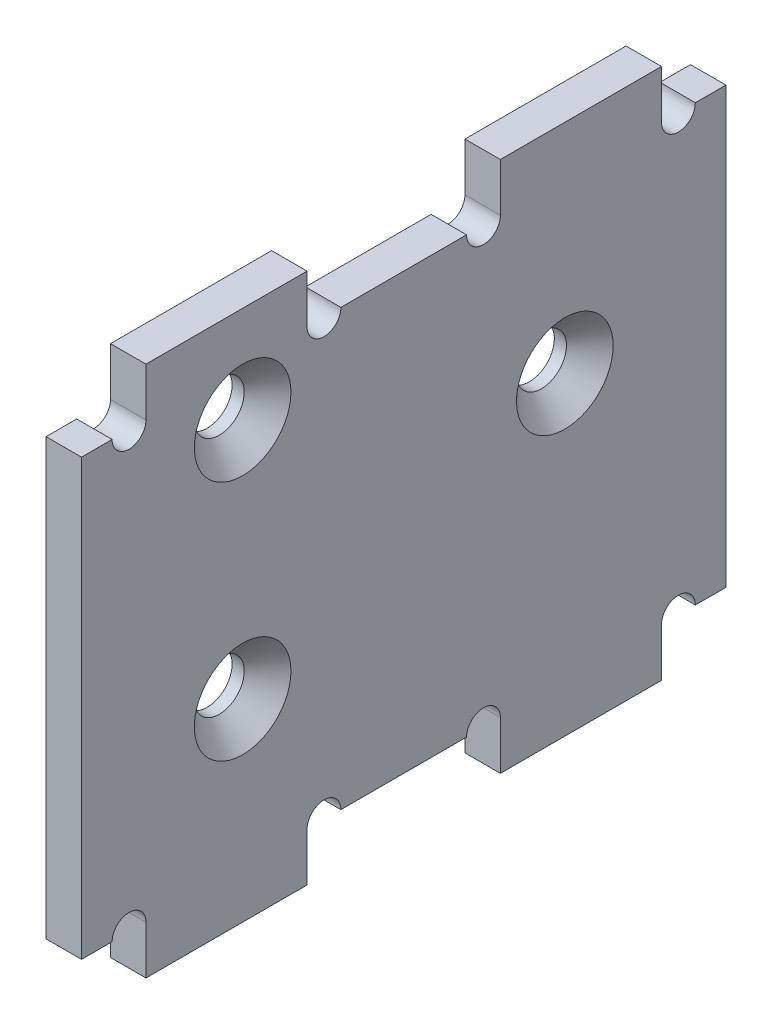
ISO-10303-21;
HEADER;
FILE_DESCRIPTION(('STEP AP214'),'2;1');
FILE_NAME('part.step','',(''),(''),'','','');
FILE_SCHEMA(('AUTOMOTIVE_DESIGN { 1 0 10303 214 1 1 1 1 }'));
ENDSEC;
DATA;
#1=APPLICATION_CONTEXT('core data for automotive mechanical design processes');
#2=APPLICATION_PROTOCOL_DEFINITION('international standard','automotive_design',2000,#1);
#3=PRODUCT_CONTEXT('',#1,'mechanical');
#4=PRODUCT('Part','Part','',(#3));
#5=PRODUCT_RELATED_PRODUCT_CATEGORY('part','',(#4));
#6=PRODUCT_DEFINITION_FORMATION('','',#4);
#7=PRODUCT_DEFINITION_CONTEXT('part definition',#1,'design');
#8=PRODUCT_DEFINITION('design','',#6,#7);
#9=PRODUCT_DEFINITION_SHAPE('','',#8);
#10=(LENGTH_UNIT() NAMED_UNIT(*) SI_UNIT(.MILLI.,.METRE.));
#11=(NAMED_UNIT(*) PLANE_ANGLE_UNIT() SI_UNIT($,.RADIAN.));
#12=(NAMED_UNIT(*) SI_UNIT($,.STERADIAN.) SOLID_ANGLE_UNIT());
#13=UNCERTAINTY_MEASURE_WITH_UNIT(LENGTH_MEASURE(1.E-05),#10,'distance_accuracy_value','');
#14=(GEOMETRIC_REPRESENTATION_CONTEXT(3) GLOBAL_UNCERTAINTY_ASSIGNED_CONTEXT((#13)) GLOBAL_UNIT_ASSIGNED_CONTEXT((#10,
#11,#12)) REPRESENTATION_CONTEXT('',''));
#15=CARTESIAN_POINT('',(0.,0.,0.));
#16=DIRECTION('',(0.,0.,1.));
#17=DIRECTION('',(1.,0.,0.));
#18=AXIS2_PLACEMENT_3D('',#15,#16,#17);
#19=CARTESIAN_POINT('',(2.2,10.5,9.99999999999999));
#20=DIRECTION('',(-1.,0.,0.));
#21=DIRECTION('',(0.,0.,1.));
#22=AXIS2_PLACEMENT_3D('',#19,#20,#21);
#23=CYLINDRICAL_SURFACE('',#22,1.55);
#24=CARTESIAN_POINT('',(0.,10.5,9.99999999999999));
#25=DIRECTION('',(1.,0.,0.));
#26=DIRECTION('',(0.,0.,-1.));
#27=AXIS2_PLACEMENT_3D('',#24,#25,#26);
#28=CIRCLE('',#27,1.55);
#29=CARTESIAN_POINT('',(0.,10.5,8.44999999999999));
#30=VERTEX_POINT('',#29);
#31=EDGE_CURVE('E272',#30,#30,#28,.T.);
#32=ORIENTED_EDGE('',*,*,#31,.F.);
#33=EDGE_LOOP('',(#32));
#34=FACE_BOUND('',#33,.T.);
#35=CARTESIAN_POINT('',(0.750000000000001,10.5,9.99999999999999));
#36=DIRECTION('',(1.,0.,0.));
#37=DIRECTION('',(0.,0.,-1.));
#38=AXIS2_PLACEMENT_3D('',#35,#36,#37);
#39=CIRCLE('',#38,1.55);
#40=CARTESIAN_POINT('',(0.750000000000001,10.5,8.44999999999999));
#41=VERTEX_POINT('',#40);
#42=EDGE_CURVE('E426',#41,#41,#39,.T.);
#43=ORIENTED_EDGE('',*,*,#42,.T.);
#44=EDGE_LOOP('',(#43));
#45=FACE_BOUND('',#44,.T.);
#46=ADVANCED_FACE('F39',(#34,#45),#23,.F.);
#47=CARTESIAN_POINT('',(2.2,-13.5,0.));
#48=DIRECTION('',(0.,-1.,0.));
#49=DIRECTION('',(0.,0.,-1.));
#50=AXIS2_PLACEMENT_3D('',#47,#48,#49);
#51=PLANE('',#50);
#52=DIRECTION('',(0.,0.,1.));
#53=VECTOR('',#52,1.);
#54=CARTESIAN_POINT('',(0.,-13.5,0.));
#55=LINE('',#54,#53);
#56=CARTESIAN_POINT('',(0.,-13.5,18.1));
#57=VERTEX_POINT('',#56);
#58=CARTESIAN_POINT('',(0.,-13.5,20.));
#59=VERTEX_POINT('',#58);
#60=EDGE_CURVE('E256',#57,#59,#55,.T.);
#61=ORIENTED_EDGE('',*,*,#60,.F.);
#62=DIRECTION('',(-1.,0.,0.));
#63=VECTOR('',#62,1.);
#64=CARTESIAN_POINT('',(2.2,-13.5,18.1));
#65=LINE('',#64,#63);
#66=CARTESIAN_POINT('',(2.2,-13.5,18.1));
#67=VERTEX_POINT('',#66);
#68=EDGE_CURVE('E12',#67,#57,#65,.T.);
#69=ORIENTED_EDGE('',*,*,#68,.F.);
#70=DIRECTION('',(0.,0.,1.));
#71=VECTOR('',#70,1.);
#72=CARTESIAN_POINT('',(2.2,-13.5,0.));
#73=LINE('',#72,#71);
#74=CARTESIAN_POINT('',(2.2,-13.5,20.));
#75=VERTEX_POINT('',#74);
#76=EDGE_CURVE('E444',#67,#75,#73,.T.);
#77=ORIENTED_EDGE('',*,*,#76,.T.);
#78=DIRECTION('',(-1.,0.,0.));
#79=VECTOR('',#78,1.);
#80=CARTESIAN_POINT('',(2.2,-13.5,20.));
#81=LINE('',#80,#79);
#82=EDGE_CURVE('E56',#75,#59,#81,.T.);
#83=ORIENTED_EDGE('',*,*,#82,.T.);
#84=EDGE_LOOP('',(#61,#69,#77,#83));
#85=FACE_BOUND('',#84,.T.);
#86=ADVANCED_FACE('F41',(#85),#51,.T.);
#87=CARTESIAN_POINT('',(2.2,-13.5,17.05));
#88=DIRECTION('',(-1.,0.,0.));
#89=DIRECTION('',(0.,0.,1.));
#90=AXIS2_PLACEMENT_3D('',#87,#88,#89);
#91=CYLINDRICAL_SURFACE('',#90,1.05);
#92=CARTESIAN_POINT('',(0.,-13.5,17.05));
#93=DIRECTION('',(1.,0.,0.));
#94=DIRECTION('',(0.,0.,-1.));
#95=AXIS2_PLACEMENT_3D('',#92,#93,#94);
#96=CIRCLE('',#95,1.05);
#97=CARTESIAN_POINT('',(0.,-13.5,16.));
#98=VERTEX_POINT('',#97);
#99=EDGE_CURVE('E259',#57,#98,#96,.F.);
#100=ORIENTED_EDGE('',*,*,#99,.T.);
#101=DIRECTION('',(-1.,0.,0.));
#102=VECTOR('',#101,1.);
#103=CARTESIAN_POINT('',(2.2,-13.5,16.));
#104=LINE('',#103,#102);
#105=CARTESIAN_POINT('',(2.2,-13.5,16.));
#106=VERTEX_POINT('',#105);
#107=EDGE_CURVE('E48',#106,#98,#104,.T.);
#108=ORIENTED_EDGE('',*,*,#107,.F.);
#109=CARTESIAN_POINT('',(2.2,-13.5,17.05));
#110=DIRECTION('',(1.,0.,0.));
#111=DIRECTION('',(0.,0.,-1.));
#112=AXIS2_PLACEMENT_3D('',#109,#110,#111);
#113=CIRCLE('',#112,1.05);
#114=EDGE_CURVE('E446',#67,#106,#113,.F.);
#115=ORIENTED_EDGE('',*,*,#114,.F.);
#116=ORIENTED_EDGE('',*,*,#68,.T.);
#117=EDGE_LOOP('',(#100,#108,#115,#116));
#118=FACE_BOUND('',#117,.T.);
#119=ADVANCED_FACE('F401',(#118),#91,.F.);
#120=CARTESIAN_POINT('',(2.2,0.,16.));
#121=DIRECTION('',(0.,0.,-1.));
#122=DIRECTION('',(0.,1.,0.));
#123=AXIS2_PLACEMENT_3D('',#120,#121,#122);
#124=PLANE('',#123);
#125=DIRECTION('',(0.,-1.,0.));
#126=VECTOR('',#125,1.);
#127=CARTESIAN_POINT('',(0.,0.,16.));
#128=LINE('',#127,#126);
#129=CARTESIAN_POINT('',(0.,-16.5,16.));
#130=VERTEX_POINT('',#129);
#131=EDGE_CURVE('E285',#98,#130,#128,.T.);
#132=ORIENTED_EDGE('',*,*,#131,.T.);
#133=DIRECTION('',(-1.,0.,0.));
#134=VECTOR('',#133,1.);
#135=CARTESIAN_POINT('',(2.2,-16.5,16.));
#136=LINE('',#135,#134);
#137=CARTESIAN_POINT('',(2.2,-16.5,16.));
#138=VERTEX_POINT('',#137);
#139=EDGE_CURVE('E563',#138,#130,#136,.T.);
#140=ORIENTED_EDGE('',*,*,#139,.F.);
#141=DIRECTION('',(0.,-1.,0.));
#142=VECTOR('',#141,1.);
#143=CARTESIAN_POINT('',(2.2,0.,16.));
#144=LINE('',#143,#142);
#145=EDGE_CURVE('E449',#106,#138,#144,.T.);
#146=ORIENTED_EDGE('',*,*,#145,.F.);
#147=ORIENTED_EDGE('',*,*,#107,.T.);
#148=EDGE_LOOP('',(#132,#140,#146,#147));
#149=FACE_BOUND('',#148,.T.);
#150=ADVANCED_FACE('F570',(#149),#124,.F.);
#151=CARTESIAN_POINT('',(2.2,-16.5,0.));
#152=DIRECTION('',(0.,1.,0.));
#153=DIRECTION('',(0.,0.,1.));
#154=AXIS2_PLACEMENT_3D('',#151,#152,#153);
#155=PLANE('',#154);
#156=DIRECTION('',(0.,0.,-1.));
#157=VECTOR('',#156,1.);
#158=CARTESIAN_POINT('',(0.,-16.5,0.));
#159=LINE('',#158,#157);
#160=CARTESIAN_POINT('',(0.,-16.5,5.99999999999999));
#161=VERTEX_POINT('',#160);
#162=EDGE_CURVE('E287',#130,#161,#159,.T.);
#163=ORIENTED_EDGE('',*,*,#162,.T.);
#164=DIRECTION('',(-1.,0.,0.));
#165=VECTOR('',#164,1.);
#166=CARTESIAN_POINT('',(2.2,-16.5,5.99999999999999));
#167=LINE('',#166,#165);
#168=CARTESIAN_POINT('',(2.2,-16.5,5.99999999999999));
#169=VERTEX_POINT('',#168);
#170=EDGE_CURVE('E560',#169,#161,#167,.T.);
#171=ORIENTED_EDGE('',*,*,#170,.F.);
#172=DIRECTION('',(0.,0.,-1.));
#173=VECTOR('',#172,1.);
#174=CARTESIAN_POINT('',(2.2,-16.5,0.));
#175=LINE('',#174,#173);
#176=EDGE_CURVE('E451',#138,#169,#175,.T.);
#177=ORIENTED_EDGE('',*,*,#176,.F.);
#178=ORIENTED_EDGE('',*,*,#139,.T.);
#179=EDGE_LOOP('',(#163,#171,#177,#178));
#180=FACE_BOUND('',#179,.T.);
#181=ADVANCED_FACE('F578',(#180),#155,.F.);
#182=CARTESIAN_POINT('',(2.2,0.,6.));
#183=DIRECTION('',(0.,0.,1.));
#184=DIRECTION('',(0.,-1.,0.));
#185=AXIS2_PLACEMENT_3D('',#182,#183,#184);
#186=PLANE('',#185);
#187=DIRECTION('',(0.,1.,0.));
#188=VECTOR('',#187,1.);
#189=CARTESIAN_POINT('',(0.,0.,6.));
#190=LINE('',#189,#188);
#191=CARTESIAN_POINT('',(0.,-13.5,6.));
#192=VERTEX_POINT('',#191);
#193=EDGE_CURVE('E290',#161,#192,#190,.T.);
#194=ORIENTED_EDGE('',*,*,#193,.T.);
#195=DIRECTION('',(-1.,0.,0.));
#196=VECTOR('',#195,1.);
#197=CARTESIAN_POINT('',(2.2,-13.5,6.));
#198=LINE('',#197,#196);
#199=CARTESIAN_POINT('',(2.2,-13.5,6.));
#200=VERTEX_POINT('',#199);
#201=EDGE_CURVE('E557',#200,#192,#198,.T.);
#202=ORIENTED_EDGE('',*,*,#201,.F.);
#203=DIRECTION('',(0.,1.,0.));
#204=VECTOR('',#203,1.);
#205=CARTESIAN_POINT('',(2.2,0.,6.));
#206=LINE('',#205,#204);
#207=EDGE_CURVE('E453',#169,#200,#206,.T.);
#208=ORIENTED_EDGE('',*,*,#207,.F.);
#209=ORIENTED_EDGE('',*,*,#170,.T.);
#210=EDGE_LOOP('',(#194,#202,#208,#209));
#211=FACE_BOUND('',#210,.T.);
#212=ADVANCED_FACE('F582',(#211),#186,.F.);
#213=CARTESIAN_POINT('',(2.2,-13.5,4.94999999999999));
#214=DIRECTION('',(-1.,0.,0.));
#215=DIRECTION('',(0.,0.,1.));
#216=AXIS2_PLACEMENT_3D('',#213,#214,#215);
#217=CYLINDRICAL_SURFACE('',#216,1.05);
#218=CARTESIAN_POINT('',(0.,-13.5,4.94999999999999));
#219=DIRECTION('',(1.,0.,0.));
#220=DIRECTION('',(0.,0.,-1.));
#221=AXIS2_PLACEMENT_3D('',#218,#219,#220);
#222=CIRCLE('',#221,1.05);
#223=CARTESIAN_POINT('',(0.,-13.5,3.89999999999999));
#224=VERTEX_POINT('',#223);
#225=EDGE_CURVE('E293',#192,#224,#222,.F.);
#226=ORIENTED_EDGE('',*,*,#225,.T.);
#227=DIRECTION('',(-1.,0.,0.));
#228=VECTOR('',#227,1.);
#229=CARTESIAN_POINT('',(2.2,-13.5,3.89999999999999));
#230=LINE('',#229,#228);
#231=CARTESIAN_POINT('',(2.2,-13.5,3.89999999999999));
#232=VERTEX_POINT('',#231);
#233=EDGE_CURVE('E555',#232,#224,#230,.T.);
#234=ORIENTED_EDGE('',*,*,#233,.F.);
#235=CARTESIAN_POINT('',(2.2,-13.5,4.94999999999999));
#236=DIRECTION('',(1.,0.,0.));
#237=DIRECTION('',(0.,0.,-1.));
#238=AXIS2_PLACEMENT_3D('',#235,#236,#237);
#239=CIRCLE('',#238,1.05);
#240=EDGE_CURVE('E455',#200,#232,#239,.F.);
#241=ORIENTED_EDGE('',*,*,#240,.F.);
#242=ORIENTED_EDGE('',*,*,#201,.T.);
#243=EDGE_LOOP('',(#226,#234,#241,#242));
#244=FACE_BOUND('',#243,.T.);
#245=ADVANCED_FACE('F597',(#244),#217,.F.);
#246=CARTESIAN_POINT('',(2.2,-13.5,0.));
#247=DIRECTION('',(0.,-1.,0.));
#248=DIRECTION('',(0.,0.,-1.));
#249=AXIS2_PLACEMENT_3D('',#246,#247,#248);
#250=PLANE('',#249);
#251=DIRECTION('',(0.,0.,1.));
#252=VECTOR('',#251,1.);
#253=CARTESIAN_POINT('',(0.,-13.5,0.));
#254=LINE('',#253,#252);
#255=CARTESIAN_POINT('',(0.,-13.5,-3.90000000000002));
#256=VERTEX_POINT('',#255);
#257=EDGE_CURVE('E299',#256,#224,#254,.T.);
#258=ORIENTED_EDGE('',*,*,#257,.F.);
#259=DIRECTION('',(-1.,0.,0.));
#260=VECTOR('',#259,1.);
#261=CARTESIAN_POINT('',(2.2,-13.5,-3.90000000000002));
#262=LINE('',#261,#260);
#263=CARTESIAN_POINT('',(2.2,-13.5,-3.90000000000002));
#264=VERTEX_POINT('',#263);
#265=EDGE_CURVE('E553',#264,#256,#262,.T.);
#266=ORIENTED_EDGE('',*,*,#265,.F.);
#267=DIRECTION('',(0.,0.,1.));
#268=VECTOR('',#267,1.);
#269=CARTESIAN_POINT('',(2.2,-13.5,0.));
#270=LINE('',#269,#268);
#271=EDGE_CURVE('E457',#264,#232,#270,.T.);
#272=ORIENTED_EDGE('',*,*,#271,.T.);
#273=ORIENTED_EDGE('',*,*,#233,.T.);
#274=EDGE_LOOP('',(#258,#266,#272,#273));
#275=FACE_BOUND('',#274,.T.);
#276=ADVANCED_FACE('F600',(#275),#250,.T.);
#277=CARTESIAN_POINT('',(2.2,-13.5,-4.95000000000002));
#278=DIRECTION('',(-1.,0.,0.));
#279=DIRECTION('',(0.,0.,1.));
#280=AXIS2_PLACEMENT_3D('',#277,#278,#279);
#281=CYLINDRICAL_SURFACE('',#280,1.05);
#282=CARTESIAN_POINT('',(0.,-13.5,-4.95000000000002));
#283=DIRECTION('',(1.,0.,0.));
#284=DIRECTION('',(0.,0.,-1.));
#285=AXIS2_PLACEMENT_3D('',#282,#283,#284);
#286=CIRCLE('',#285,1.05);
#287=CARTESIAN_POINT('',(0.,-13.5,-6.00000000000003));
#288=VERTEX_POINT('',#287);
#289=EDGE_CURVE('E302',#288,#256,#286,.T.);
#290=ORIENTED_EDGE('',*,*,#289,.F.);
#291=DIRECTION('',(-1.,0.,0.));
#292=VECTOR('',#291,1.);
#293=CARTESIAN_POINT('',(2.2,-13.5,-6.00000000000003));
#294=LINE('',#293,#292);
#295=CARTESIAN_POINT('',(2.2,-13.5,-6.00000000000003));
#296=VERTEX_POINT('',#295);
#297=EDGE_CURVE('E551',#296,#288,#294,.T.);
#298=ORIENTED_EDGE('',*,*,#297,.F.);
#299=CARTESIAN_POINT('',(2.2,-13.5,-4.95000000000002));
#300=DIRECTION('',(1.,0.,0.));
#301=DIRECTION('',(0.,0.,-1.));
#302=AXIS2_PLACEMENT_3D('',#299,#300,#301);
#303=CIRCLE('',#302,1.05);
#304=EDGE_CURVE('E460',#296,#264,#303,.T.);
#305=ORIENTED_EDGE('',*,*,#304,.T.);
#306=ORIENTED_EDGE('',*,*,#265,.T.);
#307=EDGE_LOOP('',(#290,#298,#305,#306));
#308=FACE_BOUND('',#307,.T.);
#309=ADVANCED_FACE('F604',(#308),#281,.F.);
#310=CARTESIAN_POINT('',(2.2,0.,-6.00000000000003));
#311=DIRECTION('',(0.,0.,1.));
#312=DIRECTION('',(0.,-1.,0.));
#313=AXIS2_PLACEMENT_3D('',#310,#311,#312);
#314=PLANE('',#313);
#315=DIRECTION('',(0.,1.,0.));
#316=VECTOR('',#315,1.);
#317=CARTESIAN_POINT('',(0.,0.,-6.00000000000003));
#318=LINE('',#317,#316);
#319=CARTESIAN_POINT('',(0.,-16.5,-6.00000000000002));
#320=VERTEX_POINT('',#319);
#321=EDGE_CURVE('E306',#320,#288,#318,.T.);
#322=ORIENTED_EDGE('',*,*,#321,.F.);
#323=DIRECTION('',(-1.,0.,0.));
#324=VECTOR('',#323,1.);
#325=CARTESIAN_POINT('',(2.2,-16.5,-6.00000000000002));
#326=LINE('',#325,#324);
#327=CARTESIAN_POINT('',(2.2,-16.5,-6.00000000000002));
#328=VERTEX_POINT('',#327);
#329=EDGE_CURVE('E549',#328,#320,#326,.T.);
#330=ORIENTED_EDGE('',*,*,#329,.F.);
#331=DIRECTION('',(0.,1.,0.));
#332=VECTOR('',#331,1.);
#333=CARTESIAN_POINT('',(2.2,0.,-6.00000000000003));
#334=LINE('',#333,#332);
#335=EDGE_CURVE('E463',#328,#296,#334,.T.);
#336=ORIENTED_EDGE('',*,*,#335,.T.);
#337=ORIENTED_EDGE('',*,*,#297,.T.);
#338=EDGE_LOOP('',(#322,#330,#336,#337));
#339=FACE_BOUND('',#338,.T.);
#340=ADVANCED_FACE('F608',(#339),#314,.T.);
#341=CARTESIAN_POINT('',(2.2,-16.5,0.));
#342=DIRECTION('',(0.,-1.,0.));
#343=DIRECTION('',(0.,0.,-1.));
#344=AXIS2_PLACEMENT_3D('',#341,#342,#343);
#345=PLANE('',#344);
#346=DIRECTION('',(0.,0.,1.));
#347=VECTOR('',#346,1.);
#348=CARTESIAN_POINT('',(0.,-16.5,0.));
#349=LINE('',#348,#347);
#350=CARTESIAN_POINT('',(0.,-16.5,-16.));
#351=VERTEX_POINT('',#350);
#352=EDGE_CURVE('E310',#351,#320,#349,.T.);
#353=ORIENTED_EDGE('',*,*,#352,.F.);
#354=DIRECTION('',(-1.,0.,0.));
#355=VECTOR('',#354,1.);
#356=CARTESIAN_POINT('',(2.2,-16.5,-16.));
#357=LINE('',#356,#355);
#358=CARTESIAN_POINT('',(2.2,-16.5,-16.));
#359=VERTEX_POINT('',#358);
#360=EDGE_CURVE('E547',#359,#351,#357,.T.);
#361=ORIENTED_EDGE('',*,*,#360,.F.);
#362=DIRECTION('',(0.,0.,1.));
#363=VECTOR('',#362,1.);
#364=CARTESIAN_POINT('',(2.2,-16.5,0.));
#365=LINE('',#364,#363);
#366=EDGE_CURVE('E466',#359,#328,#365,.T.);
#367=ORIENTED_EDGE('',*,*,#366,.T.);
#368=ORIENTED_EDGE('',*,*,#329,.T.);
#369=EDGE_LOOP('',(#353,#361,#367,#368));
#370=FACE_BOUND('',#369,.T.);
#371=ADVANCED_FACE('F612',(#370),#345,.T.);
#372=CARTESIAN_POINT('',(2.2,0.,-16.));
#373=DIRECTION('',(0.,0.,-1.));
#374=DIRECTION('',(0.,1.,0.));
#375=AXIS2_PLACEMENT_3D('',#372,#373,#374);
#376=PLANE('',#375);
#377=DIRECTION('',(0.,-1.,0.));
#378=VECTOR('',#377,1.);
#379=CARTESIAN_POINT('',(0.,0.,-16.));
#380=LINE('',#379,#378);
#381=CARTESIAN_POINT('',(0.,-13.5,-16.));
#382=VERTEX_POINT('',#381);
#383=EDGE_CURVE('E318',#382,#351,#380,.T.);
#384=ORIENTED_EDGE('',*,*,#383,.F.);
#385=DIRECTION('',(-1.,0.,0.));
#386=VECTOR('',#385,1.);
#387=CARTESIAN_POINT('',(2.2,-13.5,-16.));
#388=LINE('',#387,#386);
#389=CARTESIAN_POINT('',(2.2,-13.5,-16.));
#390=VERTEX_POINT('',#389);
#391=EDGE_CURVE('E545',#390,#382,#388,.T.);
#392=ORIENTED_EDGE('',*,*,#391,.F.);
#393=DIRECTION('',(0.,-1.,0.));
#394=VECTOR('',#393,1.);
#395=CARTESIAN_POINT('',(2.2,0.,-16.));
#396=LINE('',#395,#394);
#397=EDGE_CURVE('E469',#390,#359,#396,.T.);
#398=ORIENTED_EDGE('',*,*,#397,.T.);
#399=ORIENTED_EDGE('',*,*,#360,.T.);
#400=EDGE_LOOP('',(#384,#392,#398,#399));
#401=FACE_BOUND('',#400,.T.);
#402=ADVANCED_FACE('F616',(#401),#376,.T.);
#403=CARTESIAN_POINT('',(2.2,-13.5,-17.05));
#404=DIRECTION('',(-1.,0.,0.));
#405=DIRECTION('',(0.,0.,1.));
#406=AXIS2_PLACEMENT_3D('',#403,#404,#405);
#407=CYLINDRICAL_SURFACE('',#406,1.05);
#408=CARTESIAN_POINT('',(0.,-13.5,-17.05));
#409=DIRECTION('',(1.,0.,0.));
#410=DIRECTION('',(0.,0.,-1.));
#411=AXIS2_PLACEMENT_3D('',#408,#409,#410);
#412=CIRCLE('',#411,1.05);
#413=CARTESIAN_POINT('',(0.,-13.5,-18.1));
#414=VERTEX_POINT('',#413);
#415=EDGE_CURVE('E321',#414,#382,#412,.T.);
#416=ORIENTED_EDGE('',*,*,#415,.F.);
#417=DIRECTION('',(-1.,0.,0.));
#418=VECTOR('',#417,1.);
#419=CARTESIAN_POINT('',(2.2,-13.5,-18.1));
#420=LINE('',#419,#418);
#421=CARTESIAN_POINT('',(2.2,-13.5,-18.1));
#422=VERTEX_POINT('',#421);
#423=EDGE_CURVE('E543',#422,#414,#420,.T.);
#424=ORIENTED_EDGE('',*,*,#423,.F.);
#425=CARTESIAN_POINT('',(2.2,-13.5,-17.05));
#426=DIRECTION('',(1.,0.,0.));
#427=DIRECTION('',(0.,0.,-1.));
#428=AXIS2_PLACEMENT_3D('',#425,#426,#427);
#429=CIRCLE('',#428,1.05);
#430=EDGE_CURVE('E472',#422,#390,#429,.T.);
#431=ORIENTED_EDGE('',*,*,#430,.T.);
#432=ORIENTED_EDGE('',*,*,#391,.T.);
#433=EDGE_LOOP('',(#416,#424,#431,#432));
#434=FACE_BOUND('',#433,.T.);
#435=ADVANCED_FACE('F620',(#434),#407,.F.);
#436=CARTESIAN_POINT('',(2.2,-13.5,0.));
#437=DIRECTION('',(0.,-1.,0.));
#438=DIRECTION('',(0.,0.,-1.));
#439=AXIS2_PLACEMENT_3D('',#436,#437,#438);
#440=PLANE('',#439);
#441=DIRECTION('',(0.,0.,1.));
#442=VECTOR('',#441,1.);
#443=CARTESIAN_POINT('',(0.,-13.5,0.));
#444=LINE('',#443,#442);
#445=CARTESIAN_POINT('',(0.,-13.5,-19.9999999999999));
#446=VERTEX_POINT('',#445);
#447=EDGE_CURVE('E325',#446,#414,#444,.T.);
#448=ORIENTED_EDGE('',*,*,#447,.F.);
#449=DIRECTION('',(-1.,0.,0.));
#450=VECTOR('',#449,1.);
#451=CARTESIAN_POINT('',(2.2,-13.5,-19.9999999999999));
#452=LINE('',#451,#450);
#453=CARTESIAN_POINT('',(2.2,-13.5,-19.9999999999999));
#454=VERTEX_POINT('',#453);
#455=EDGE_CURVE('E541',#454,#446,#452,.T.);
#456=ORIENTED_EDGE('',*,*,#455,.F.);
#457=DIRECTION('',(0.,0.,1.));
#458=VECTOR('',#457,1.);
#459=CARTESIAN_POINT('',(2.2,-13.5,0.));
#460=LINE('',#459,#458);
#461=EDGE_CURVE('E475',#454,#422,#460,.T.);
#462=ORIENTED_EDGE('',*,*,#461,.T.);
#463=ORIENTED_EDGE('',*,*,#423,.T.);
#464=EDGE_LOOP('',(#448,#456,#462,#463));
#465=FACE_BOUND('',#464,.T.);
#466=ADVANCED_FACE('F624',(#465),#440,.T.);
#467=CARTESIAN_POINT('',(2.2,0.,-19.9999999999999));
#468=DIRECTION('',(0.,0.,1.));
#469=DIRECTION('',(1.,0.,0.));
#470=AXIS2_PLACEMENT_3D('',#467,#468,#469);
#471=PLANE('',#470);
#472=DIRECTION('',(0.,1.,0.));
#473=VECTOR('',#472,1.);
#474=CARTESIAN_POINT('',(0.,0.,-19.9999999999999));
#475=LINE('',#474,#473);
#476=CARTESIAN_POINT('',(0.,13.5,-19.9999999999999));
#477=VERTEX_POINT('',#476);
#478=EDGE_CURVE('E329',#446,#477,#475,.T.);
#479=ORIENTED_EDGE('',*,*,#478,.T.);
#480=DIRECTION('',(-1.,0.,0.));
#481=VECTOR('',#480,1.);
#482=CARTESIAN_POINT('',(2.2,13.5,-19.9999999999999));
#483=LINE('',#482,#481);
#484=CARTESIAN_POINT('',(2.2,13.5,-19.9999999999999));
#485=VERTEX_POINT('',#484);
#486=EDGE_CURVE('E538',#485,#477,#483,.T.);
#487=ORIENTED_EDGE('',*,*,#486,.F.);
#488=DIRECTION('',(0.,1.,0.));
#489=VECTOR('',#488,1.);
#490=CARTESIAN_POINT('',(2.2,0.,-19.9999999999999));
#491=LINE('',#490,#489);
#492=EDGE_CURVE('E478',#454,#485,#491,.T.);
#493=ORIENTED_EDGE('',*,*,#492,.F.);
#494=ORIENTED_EDGE('',*,*,#455,.T.);
#495=EDGE_LOOP('',(#479,#487,#493,#494));
#496=FACE_BOUND('',#495,.T.);
#497=ADVANCED_FACE('F628',(#496),#471,.F.);
#498=CARTESIAN_POINT('',(2.2,13.5,0.));
#499=DIRECTION('',(0.,-1.,0.));
#500=DIRECTION('',(0.,0.,-1.));
#501=AXIS2_PLACEMENT_3D('',#498,#499,#500);
#502=PLANE('',#501);
#503=DIRECTION('',(0.,0.,1.));
#504=VECTOR('',#503,1.);
#505=CARTESIAN_POINT('',(0.,13.5,0.));
#506=LINE('',#505,#504);
#507=CARTESIAN_POINT('',(0.,13.5,-18.1));
#508=VERTEX_POINT('',#507);
#509=EDGE_CURVE('E337',#477,#508,#506,.T.);
#510=ORIENTED_EDGE('',*,*,#509,.T.);
#511=DIRECTION('',(-1.,0.,0.));
#512=VECTOR('',#511,1.);
#513=CARTESIAN_POINT('',(2.2,13.5,-18.1));
#514=LINE('',#513,#512);
#515=CARTESIAN_POINT('',(2.2,13.5,-18.1));
#516=VERTEX_POINT('',#515);
#517=EDGE_CURVE('E535',#516,#508,#514,.T.);
#518=ORIENTED_EDGE('',*,*,#517,.F.);
#519=DIRECTION('',(0.,0.,1.));
#520=VECTOR('',#519,1.);
#521=CARTESIAN_POINT('',(2.2,13.5,0.));
#522=LINE('',#521,#520);
#523=EDGE_CURVE('E480',#485,#516,#522,.T.);
#524=ORIENTED_EDGE('',*,*,#523,.F.);
#525=ORIENTED_EDGE('',*,*,#486,.T.);
#526=EDGE_LOOP('',(#510,#518,#524,#525));
#527=FACE_BOUND('',#526,.T.);
#528=ADVANCED_FACE('F632',(#527),#502,.F.);
#529=CARTESIAN_POINT('',(2.2,13.5,-17.05));
#530=DIRECTION('',(-1.,0.,0.));
#531=DIRECTION('',(0.,0.,1.));
#532=AXIS2_PLACEMENT_3D('',#529,#530,#531);
#533=CYLINDRICAL_SURFACE('',#532,1.05);
#534=CARTESIAN_POINT('',(0.,13.5,-17.05));
#535=DIRECTION('',(1.,0.,0.));
#536=DIRECTION('',(0.,0.,-1.));
#537=AXIS2_PLACEMENT_3D('',#534,#535,#536);
#538=CIRCLE('',#537,1.05);
#539=CARTESIAN_POINT('',(0.,13.5,-16.));
#540=VERTEX_POINT('',#539);
#541=EDGE_CURVE('E340',#508,#540,#538,.F.);
#542=ORIENTED_EDGE('',*,*,#541,.T.);
#543=DIRECTION('',(-1.,0.,0.));
#544=VECTOR('',#543,1.);
#545=CARTESIAN_POINT('',(2.2,13.5,-16.));
#546=LINE('',#545,#544);
#547=CARTESIAN_POINT('',(2.2,13.5,-16.));
#548=VERTEX_POINT('',#547);
#549=EDGE_CURVE('E532',#548,#540,#546,.T.);
#550=ORIENTED_EDGE('',*,*,#549,.F.);
#551=CARTESIAN_POINT('',(2.2,13.5,-17.05));
#552=DIRECTION('',(1.,0.,0.));
#553=DIRECTION('',(0.,0.,-1.));
#554=AXIS2_PLACEMENT_3D('',#551,#552,#553);
#555=CIRCLE('',#554,1.05);
#556=EDGE_CURVE('E482',#516,#548,#555,.F.);
#557=ORIENTED_EDGE('',*,*,#556,.F.);
#558=ORIENTED_EDGE('',*,*,#517,.T.);
#559=EDGE_LOOP('',(#542,#550,#557,#558));
#560=FACE_BOUND('',#559,.T.);
#561=ADVANCED_FACE('F636',(#560),#533,.F.);
#562=CARTESIAN_POINT('',(2.2,0.,-16.));
#563=DIRECTION('',(0.,0.,1.));
#564=DIRECTION('',(0.,-1.,0.));
#565=AXIS2_PLACEMENT_3D('',#562,#563,#564);
#566=PLANE('',#565);
#567=DIRECTION('',(0.,1.,0.));
#568=VECTOR('',#567,1.);
#569=CARTESIAN_POINT('',(0.,0.,-16.));
#570=LINE('',#569,#568);
#571=CARTESIAN_POINT('',(0.,16.5,-16.));
#572=VERTEX_POINT('',#571);
#573=EDGE_CURVE('E341',#540,#572,#570,.T.);
#574=ORIENTED_EDGE('',*,*,#573,.T.);
#575=DIRECTION('',(-1.,0.,0.));
#576=VECTOR('',#575,1.);
#577=CARTESIAN_POINT('',(2.2,16.5,-16.));
#578=LINE('',#577,#576);
#579=CARTESIAN_POINT('',(2.2,16.5,-16.));
#580=VERTEX_POINT('',#579);
#581=EDGE_CURVE('E529',#580,#572,#578,.T.);
#582=ORIENTED_EDGE('',*,*,#581,.F.);
#583=DIRECTION('',(0.,1.,0.));
#584=VECTOR('',#583,1.);
#585=CARTESIAN_POINT('',(2.2,0.,-16.));
#586=LINE('',#585,#584);
#587=EDGE_CURVE('E484',#548,#580,#586,.T.);
#588=ORIENTED_EDGE('',*,*,#587,.F.);
#589=ORIENTED_EDGE('',*,*,#549,.T.);
#590=EDGE_LOOP('',(#574,#582,#588,#589));
#591=FACE_BOUND('',#590,.T.);
#592=ADVANCED_FACE('F640',(#591),#566,.F.);
#593=CARTESIAN_POINT('',(2.2,16.5,0.));
#594=DIRECTION('',(0.,-1.,0.));
#595=DIRECTION('',(0.,0.,-1.));
#596=AXIS2_PLACEMENT_3D('',#593,#594,#595);
#597=PLANE('',#596);
#598=DIRECTION('',(0.,0.,1.));
#599=VECTOR('',#598,1.);
#600=CARTESIAN_POINT('',(0.,16.5,0.));
#601=LINE('',#600,#599);
#602=CARTESIAN_POINT('',(0.,16.5,-6.00000000000001));
#603=VERTEX_POINT('',#602);
#604=EDGE_CURVE('E344',#572,#603,#601,.T.);
#605=ORIENTED_EDGE('',*,*,#604,.T.);
#606=DIRECTION('',(-1.,0.,0.));
#607=VECTOR('',#606,1.);
#608=CARTESIAN_POINT('',(2.2,16.5,-6.00000000000001));
#609=LINE('',#608,#607);
#610=CARTESIAN_POINT('',(2.2,16.5,-6.00000000000001));
#611=VERTEX_POINT('',#610);
#612=EDGE_CURVE('E526',#611,#603,#609,.T.);
#613=ORIENTED_EDGE('',*,*,#612,.F.);
#614=DIRECTION('',(0.,0.,1.));
#615=VECTOR('',#614,1.);
#616=CARTESIAN_POINT('',(2.2,16.5,0.));
#617=LINE('',#616,#615);
#618=EDGE_CURVE('E486',#580,#611,#617,.T.);
#619=ORIENTED_EDGE('',*,*,#618,.F.);
#620=ORIENTED_EDGE('',*,*,#581,.T.);
#621=EDGE_LOOP('',(#605,#613,#619,#620));
#622=FACE_BOUND('',#621,.T.);
#623=ADVANCED_FACE('F644',(#622),#597,.F.);
#624=CARTESIAN_POINT('',(2.2,0.,-6.00000000000006));
#625=DIRECTION('',(0.,0.,-1.));
#626=DIRECTION('',(0.,1.,0.));
#627=AXIS2_PLACEMENT_3D('',#624,#625,#626);
#628=PLANE('',#627);
#629=DIRECTION('',(0.,-1.,0.));
#630=VECTOR('',#629,1.);
#631=CARTESIAN_POINT('',(0.,0.,-6.00000000000006));
#632=LINE('',#631,#630);
#633=CARTESIAN_POINT('',(0.,13.5,-6.00000000000002));
#634=VERTEX_POINT('',#633);
#635=EDGE_CURVE('E347',#603,#634,#632,.T.);
#636=ORIENTED_EDGE('',*,*,#635,.T.);
#637=DIRECTION('',(-1.,0.,0.));
#638=VECTOR('',#637,1.);
#639=CARTESIAN_POINT('',(2.2,13.5,-6.00000000000002));
#640=LINE('',#639,#638);
#641=CARTESIAN_POINT('',(2.2,13.5,-6.00000000000002));
#642=VERTEX_POINT('',#641);
#643=EDGE_CURVE('E523',#642,#634,#640,.T.);
#644=ORIENTED_EDGE('',*,*,#643,.F.);
#645=DIRECTION('',(0.,-1.,0.));
#646=VECTOR('',#645,1.);
#647=CARTESIAN_POINT('',(2.2,0.,-6.00000000000006));
#648=LINE('',#647,#646);
#649=EDGE_CURVE('E488',#611,#642,#648,.T.);
#650=ORIENTED_EDGE('',*,*,#649,.F.);
#651=ORIENTED_EDGE('',*,*,#612,.T.);
#652=EDGE_LOOP('',(#636,#644,#650,#651));
#653=FACE_BOUND('',#652,.T.);
#654=ADVANCED_FACE('F648',(#653),#628,.F.);
#655=CARTESIAN_POINT('',(2.2,13.5,-4.95000000000002));
#656=DIRECTION('',(-1.,0.,0.));
#657=DIRECTION('',(0.,0.,1.));
#658=AXIS2_PLACEMENT_3D('',#655,#656,#657);
#659=CYLINDRICAL_SURFACE('',#658,1.05);
#660=CARTESIAN_POINT('',(0.,13.5,-4.95000000000002));
#661=DIRECTION('',(1.,0.,0.));
#662=DIRECTION('',(0.,0.,-1.));
#663=AXIS2_PLACEMENT_3D('',#660,#661,#662);
#664=CIRCLE('',#663,1.05);
#665=CARTESIAN_POINT('',(0.,13.5,-3.90000000000002));
#666=VERTEX_POINT('',#665);
#667=EDGE_CURVE('E360',#634,#666,#664,.F.);
#668=ORIENTED_EDGE('',*,*,#667,.T.);
#669=DIRECTION('',(-1.,0.,0.));
#670=VECTOR('',#669,1.);
#671=CARTESIAN_POINT('',(2.2,13.5,-3.90000000000002));
#672=LINE('',#671,#670);
#673=CARTESIAN_POINT('',(2.2,13.5,-3.90000000000002));
#674=VERTEX_POINT('',#673);
#675=EDGE_CURVE('E520',#674,#666,#672,.T.);
#676=ORIENTED_EDGE('',*,*,#675,.F.);
#677=CARTESIAN_POINT('',(2.2,13.5,-4.95000000000002));
#678=DIRECTION('',(1.,0.,0.));
#679=DIRECTION('',(0.,0.,-1.));
#680=AXIS2_PLACEMENT_3D('',#677,#678,#679);
#681=CIRCLE('',#680,1.05);
#682=EDGE_CURVE('E490',#642,#674,#681,.F.);
#683=ORIENTED_EDGE('',*,*,#682,.F.);
#684=ORIENTED_EDGE('',*,*,#643,.T.);
#685=EDGE_LOOP('',(#668,#676,#683,#684));
#686=FACE_BOUND('',#685,.T.);
#687=ADVANCED_FACE('F652',(#686),#659,.F.);
#688=CARTESIAN_POINT('',(2.2,13.5,0.));
#689=DIRECTION('',(0.,-1.,0.));
#690=DIRECTION('',(0.,0.,-1.));
#691=AXIS2_PLACEMENT_3D('',#688,#689,#690);
#692=PLANE('',#691);
#693=DIRECTION('',(0.,0.,1.));
#694=VECTOR('',#693,1.);
#695=CARTESIAN_POINT('',(0.,13.5,0.));
#696=LINE('',#695,#694);
#697=CARTESIAN_POINT('',(0.,13.5,3.9));
#698=VERTEX_POINT('',#697);
#699=EDGE_CURVE('E356',#666,#698,#696,.T.);
#700=ORIENTED_EDGE('',*,*,#699,.T.);
#701=DIRECTION('',(-1.,0.,0.));
#702=VECTOR('',#701,1.);
#703=CARTESIAN_POINT('',(2.2,13.5,3.9));
#704=LINE('',#703,#702);
#705=CARTESIAN_POINT('',(2.2,13.5,3.9));
#706=VERTEX_POINT('',#705);
#707=EDGE_CURVE('E518',#706,#698,#704,.T.);
#708=ORIENTED_EDGE('',*,*,#707,.F.);
#709=DIRECTION('',(0.,0.,1.));
#710=VECTOR('',#709,1.);
#711=CARTESIAN_POINT('',(2.2,13.5,0.));
#712=LINE('',#711,#710);
#713=EDGE_CURVE('E492',#674,#706,#712,.T.);
#714=ORIENTED_EDGE('',*,*,#713,.F.);
#715=ORIENTED_EDGE('',*,*,#675,.T.);
#716=EDGE_LOOP('',(#700,#708,#714,#715));
#717=FACE_BOUND('',#716,.T.);
#718=ADVANCED_FACE('F656',(#717),#692,.F.);
#719=CARTESIAN_POINT('',(2.2,13.5,4.95));
#720=DIRECTION('',(-1.,0.,0.));
#721=DIRECTION('',(0.,0.,1.));
#722=AXIS2_PLACEMENT_3D('',#719,#720,#721);
#723=CYLINDRICAL_SURFACE('',#722,1.05);
#724=CARTESIAN_POINT('',(0.,13.5,4.95));
#725=DIRECTION('',(1.,0.,0.));
#726=DIRECTION('',(0.,0.,-1.));
#727=AXIS2_PLACEMENT_3D('',#724,#725,#726);
#728=CIRCLE('',#727,1.05);
#729=CARTESIAN_POINT('',(0.,13.5,6.));
#730=VERTEX_POINT('',#729);
#731=EDGE_CURVE('E359',#730,#698,#728,.T.);
#732=ORIENTED_EDGE('',*,*,#731,.F.);
#733=DIRECTION('',(-1.,0.,0.));
#734=VECTOR('',#733,1.);
#735=CARTESIAN_POINT('',(2.2,13.5,6.));
#736=LINE('',#735,#734);
#737=CARTESIAN_POINT('',(2.2,13.5,6.));
#738=VERTEX_POINT('',#737);
#739=EDGE_CURVE('E516',#738,#730,#736,.T.);
#740=ORIENTED_EDGE('',*,*,#739,.F.);
#741=CARTESIAN_POINT('',(2.2,13.5,4.95));
#742=DIRECTION('',(1.,0.,0.));
#743=DIRECTION('',(0.,0.,-1.));
#744=AXIS2_PLACEMENT_3D('',#741,#742,#743);
#745=CIRCLE('',#744,1.05);
#746=EDGE_CURVE('E494',#738,#706,#745,.T.);
#747=ORIENTED_EDGE('',*,*,#746,.T.);
#748=ORIENTED_EDGE('',*,*,#707,.T.);
#749=EDGE_LOOP('',(#732,#740,#747,#748));
#750=FACE_BOUND('',#749,.T.);
#751=ADVANCED_FACE('F660',(#750),#723,.F.);
#752=CARTESIAN_POINT('',(2.2,0.,6.00000000000004));
#753=DIRECTION('',(0.,0.,-1.));
#754=DIRECTION('',(0.,1.,0.));
#755=AXIS2_PLACEMENT_3D('',#752,#753,#754);
#756=PLANE('',#755);
#757=DIRECTION('',(0.,-1.,0.));
#758=VECTOR('',#757,1.);
#759=CARTESIAN_POINT('',(0.,0.,6.00000000000004));
#760=LINE('',#759,#758);
#761=CARTESIAN_POINT('',(0.,16.5,5.99999999999999));
#762=VERTEX_POINT('',#761);
#763=EDGE_CURVE('E364',#762,#730,#760,.T.);
#764=ORIENTED_EDGE('',*,*,#763,.F.);
#765=DIRECTION('',(-1.,0.,0.));
#766=VECTOR('',#765,1.);
#767=CARTESIAN_POINT('',(2.2,16.5,5.99999999999999));
#768=LINE('',#767,#766);
#769=CARTESIAN_POINT('',(2.2,16.5,5.99999999999999));
#770=VERTEX_POINT('',#769);
#771=EDGE_CURVE('E503',#770,#762,#768,.T.);
#772=ORIENTED_EDGE('',*,*,#771,.F.);
#773=DIRECTION('',(0.,-1.,0.));
#774=VECTOR('',#773,1.);
#775=CARTESIAN_POINT('',(2.2,0.,6.00000000000004));
#776=LINE('',#775,#774);
#777=EDGE_CURVE('E497',#770,#738,#776,.T.);
#778=ORIENTED_EDGE('',*,*,#777,.T.);
#779=ORIENTED_EDGE('',*,*,#739,.T.);
#780=EDGE_LOOP('',(#764,#772,#778,#779));
#781=FACE_BOUND('',#780,.T.);
#782=ADVANCED_FACE('F664',(#781),#756,.T.);
#783=CARTESIAN_POINT('',(2.2,16.5,0.));
#784=DIRECTION('',(0.,1.,0.));
#785=DIRECTION('',(0.,0.,1.));
#786=AXIS2_PLACEMENT_3D('',#783,#784,#785);
#787=PLANE('',#786);
#788=DIRECTION('',(0.,0.,-1.));
#789=VECTOR('',#788,1.);
#790=CARTESIAN_POINT('',(0.,16.5,0.));
#791=LINE('',#790,#789);
#792=CARTESIAN_POINT('',(0.,16.5,16.));
#793=VERTEX_POINT('',#792);
#794=EDGE_CURVE('E368',#793,#762,#791,.T.);
#795=ORIENTED_EDGE('',*,*,#794,.F.);
#796=DIRECTION('',(-1.,0.,0.));
#797=VECTOR('',#796,1.);
#798=CARTESIAN_POINT('',(2.2,16.5,16.));
#799=LINE('',#798,#797);
#800=CARTESIAN_POINT('',(2.2,16.5,16.));
#801=VERTEX_POINT('',#800);
#802=EDGE_CURVE('E505',#801,#793,#799,.T.);
#803=ORIENTED_EDGE('',*,*,#802,.F.);
#804=DIRECTION('',(0.,0.,-1.));
#805=VECTOR('',#804,1.);
#806=CARTESIAN_POINT('',(2.2,16.5,0.));
#807=LINE('',#806,#805);
#808=EDGE_CURVE('E251',#801,#770,#807,.T.);
#809=ORIENTED_EDGE('',*,*,#808,.T.);
#810=ORIENTED_EDGE('',*,*,#771,.T.);
#811=EDGE_LOOP('',(#795,#803,#809,#810));
#812=FACE_BOUND('',#811,.T.);
#813=ADVANCED_FACE('F502',(#812),#787,.T.);
#814=CARTESIAN_POINT('',(2.2,0.,16.));
#815=DIRECTION('',(0.,0.,1.));
#816=DIRECTION('',(0.,-1.,0.));
#817=AXIS2_PLACEMENT_3D('',#814,#815,#816);
#818=PLANE('',#817);
#819=DIRECTION('',(0.,1.,0.));
#820=VECTOR('',#819,1.);
#821=CARTESIAN_POINT('',(0.,0.,16.));
#822=LINE('',#821,#820);
#823=CARTESIAN_POINT('',(0.,13.5,16.));
#824=VERTEX_POINT('',#823);
#825=EDGE_CURVE('E373',#824,#793,#822,.T.);
#826=ORIENTED_EDGE('',*,*,#825,.F.);
#827=DIRECTION('',(-1.,0.,0.));
#828=VECTOR('',#827,1.);
#829=CARTESIAN_POINT('',(2.2,13.5,16.));
#830=LINE('',#829,#828);
#831=CARTESIAN_POINT('',(2.2,13.5,16.));
#832=VERTEX_POINT('',#831);
#833=EDGE_CURVE('E236',#832,#824,#830,.T.);
#834=ORIENTED_EDGE('',*,*,#833,.F.);
#835=DIRECTION('',(0.,1.,0.));
#836=VECTOR('',#835,1.);
#837=CARTESIAN_POINT('',(2.2,0.,16.));
#838=LINE('',#837,#836);
#839=EDGE_CURVE('E249',#832,#801,#838,.T.);
#840=ORIENTED_EDGE('',*,*,#839,.T.);
#841=ORIENTED_EDGE('',*,*,#802,.T.);
#842=EDGE_LOOP('',(#826,#834,#840,#841));
#843=FACE_BOUND('',#842,.T.);
#844=ADVANCED_FACE('F510',(#843),#818,.T.);
#845=CARTESIAN_POINT('',(2.2,13.5,17.05));
#846=DIRECTION('',(-1.,0.,0.));
#847=DIRECTION('',(0.,0.,1.));
#848=AXIS2_PLACEMENT_3D('',#845,#846,#847);
#849=CYLINDRICAL_SURFACE('',#848,1.05);
#850=CARTESIAN_POINT('',(0.,13.5,17.05));
#851=DIRECTION('',(1.,0.,0.));
#852=DIRECTION('',(0.,0.,-1.));
#853=AXIS2_PLACEMENT_3D('',#850,#851,#852);
#854=CIRCLE('',#853,1.05);
#855=CARTESIAN_POINT('',(0.,13.5,18.1));
#856=VERTEX_POINT('',#855);
#857=EDGE_CURVE('E233',#856,#824,#854,.T.);
#858=ORIENTED_EDGE('',*,*,#857,.F.);
#859=DIRECTION('',(-1.,0.,0.));
#860=VECTOR('',#859,1.);
#861=CARTESIAN_POINT('',(2.2,13.5,18.1));
#862=LINE('',#861,#860);
#863=CARTESIAN_POINT('',(2.2,13.5,18.1));
#864=VERTEX_POINT('',#863);
#865=EDGE_CURVE('E227',#864,#856,#862,.T.);
#866=ORIENTED_EDGE('',*,*,#865,.F.);
#867=CARTESIAN_POINT('',(2.2,13.5,17.05));
#868=DIRECTION('',(1.,0.,0.));
#869=DIRECTION('',(0.,0.,-1.));
#870=AXIS2_PLACEMENT_3D('',#867,#868,#869);
#871=CIRCLE('',#870,1.05);
#872=EDGE_CURVE('E231',#864,#832,#871,.T.);
#873=ORIENTED_EDGE('',*,*,#872,.T.);
#874=ORIENTED_EDGE('',*,*,#833,.T.);
#875=EDGE_LOOP('',(#858,#866,#873,#874));
#876=FACE_BOUND('',#875,.T.);
#877=ADVANCED_FACE('F229',(#876),#849,.F.);
#878=CARTESIAN_POINT('',(2.2,13.5,0.));
#879=DIRECTION('',(0.,-1.,0.));
#880=DIRECTION('',(0.,0.,-1.));
#881=AXIS2_PLACEMENT_3D('',#878,#879,#880);
#882=PLANE('',#881);
#883=DIRECTION('',(0.,0.,1.));
#884=VECTOR('',#883,1.);
#885=CARTESIAN_POINT('',(0.,13.5,0.));
#886=LINE('',#885,#884);
#887=CARTESIAN_POINT('',(0.,13.5,20.));
#888=VERTEX_POINT('',#887);
#889=EDGE_CURVE('E273',#856,#888,#886,.T.);
#890=ORIENTED_EDGE('',*,*,#889,.T.);
#891=DIRECTION('',(-1.,0.,0.));
#892=VECTOR('',#891,1.);
#893=CARTESIAN_POINT('',(2.2,13.5,20.));
#894=LINE('',#893,#892);
#895=CARTESIAN_POINT('',(2.2,13.5,20.));
#896=VERTEX_POINT('',#895);
#897=EDGE_CURVE('E142',#896,#888,#894,.T.);
#898=ORIENTED_EDGE('',*,*,#897,.F.);
#899=DIRECTION('',(0.,0.,1.));
#900=VECTOR('',#899,1.);
#901=CARTESIAN_POINT('',(2.2,13.5,0.));
#902=LINE('',#901,#900);
#903=EDGE_CURVE('E238',#864,#896,#902,.T.);
#904=ORIENTED_EDGE('',*,*,#903,.F.);
#905=ORIENTED_EDGE('',*,*,#865,.T.);
#906=EDGE_LOOP('',(#890,#898,#904,#905));
#907=FACE_BOUND('',#906,.T.);
#908=ADVANCED_FACE('F239',(#907),#882,.F.);
#909=CARTESIAN_POINT('',(2.2,3.00000000000004,-10.));
#910=DIRECTION('',(-1.,0.,0.));
#911=DIRECTION('',(0.,0.,1.));
#912=AXIS2_PLACEMENT_3D('',#909,#910,#911);
#913=CYLINDRICAL_SURFACE('',#912,1.55);
#914=CARTESIAN_POINT('',(0.750000000000001,3.00000000000004,-10.));
#915=DIRECTION('',(1.,0.,0.));
#916=DIRECTION('',(0.,0.,-1.));
#917=AXIS2_PLACEMENT_3D('',#914,#915,#916);
#918=CIRCLE('',#917,1.55);
#919=CARTESIAN_POINT('',(0.750000000000001,3.00000000000004,-11.55));
#920=VERTEX_POINT('',#919);
#921=EDGE_CURVE('E436',#920,#920,#918,.T.);
#922=ORIENTED_EDGE('',*,*,#921,.T.);
#923=EDGE_LOOP('',(#922));
#924=FACE_BOUND('',#923,.T.);
#925=CARTESIAN_POINT('',(0.,3.00000000000004,-10.));
#926=DIRECTION('',(1.,0.,0.));
#927=DIRECTION('',(0.,0.,-1.));
#928=AXIS2_PLACEMENT_3D('',#925,#926,#927);
#929=CIRCLE('',#928,1.55);
#930=CARTESIAN_POINT('',(0.,3.00000000000004,-11.55));
#931=VERTEX_POINT('',#930);
#932=EDGE_CURVE('E278',#931,#931,#929,.T.);
#933=ORIENTED_EDGE('',*,*,#932,.F.);
#934=EDGE_LOOP('',(#933));
#935=FACE_BOUND('',#934,.T.);
#936=ADVANCED_FACE('F384',(#924,#935),#913,.F.);
#937=CARTESIAN_POINT('',(2.2,0.,20.));
#938=DIRECTION('',(0.,0.,1.));
#939=DIRECTION('',(0.,-1.,0.));
#940=AXIS2_PLACEMENT_3D('',#937,#938,#939);
#941=PLANE('',#940);
#942=DIRECTION('',(0.,1.,0.));
#943=VECTOR('',#942,1.);
#944=CARTESIAN_POINT('',(0.,0.,20.));
#945=LINE('',#944,#943);
#946=EDGE_CURVE('E268',#59,#888,#945,.T.);
#947=ORIENTED_EDGE('',*,*,#946,.F.);
#948=ORIENTED_EDGE('',*,*,#82,.F.);
#949=DIRECTION('',(0.,1.,0.));
#950=VECTOR('',#949,1.);
#951=CARTESIAN_POINT('',(2.2,0.,20.));
#952=LINE('',#951,#950);
#953=EDGE_CURVE('E242',#75,#896,#952,.T.);
#954=ORIENTED_EDGE('',*,*,#953,.T.);
#955=ORIENTED_EDGE('',*,*,#897,.T.);
#956=EDGE_LOOP('',(#947,#948,#954,#955));
#957=FACE_BOUND('',#956,.T.);
#958=ADVANCED_FACE('F381',(#957),#941,.T.);
#959=CARTESIAN_POINT('',(2.2,-4.49999999999996,9.99999999999999));
#960=DIRECTION('',(-1.,0.,0.));
#961=DIRECTION('',(0.,0.,1.));
#962=AXIS2_PLACEMENT_3D('',#959,#960,#961);
#963=CYLINDRICAL_SURFACE('',#962,1.55);
#964=CARTESIAN_POINT('',(0.750000000000001,-4.49999999999996,9.99999999999999));
#965=DIRECTION('',(1.,0.,0.));
#966=DIRECTION('',(0.,0.,-1.));
#967=AXIS2_PLACEMENT_3D('',#964,#965,#966);
#968=CIRCLE('',#967,1.55);
#969=CARTESIAN_POINT('',(0.750000000000001,-4.49999999999996,8.44999999999999));
#970=VERTEX_POINT('',#969);
#971=EDGE_CURVE('E260',#970,#970,#968,.T.);
#972=ORIENTED_EDGE('',*,*,#971,.T.);
#973=EDGE_LOOP('',(#972));
#974=FACE_BOUND('',#973,.T.);
#975=CARTESIAN_POINT('',(0.,-4.49999999999996,9.99999999999999));
#976=DIRECTION('',(1.,0.,0.));
#977=DIRECTION('',(0.,0.,-1.));
#978=AXIS2_PLACEMENT_3D('',#975,#976,#977);
#979=CIRCLE('',#978,1.55);
#980=CARTESIAN_POINT('',(0.,-4.49999999999996,8.44999999999999));
#981=VERTEX_POINT('',#980);
#982=EDGE_CURVE('E447',#981,#981,#979,.F.);
#983=ORIENTED_EDGE('',*,*,#982,.T.);
#984=EDGE_LOOP('',(#983));
#985=FACE_BOUND('',#984,.T.);
#986=ADVANCED_FACE('F383',(#974,#985),#963,.F.);
#987=CARTESIAN_POINT('',(2.2,0.,0.));
#988=DIRECTION('',(1.,0.,0.));
#989=DIRECTION('',(0.,0.,-1.));
#990=AXIS2_PLACEMENT_3D('',#987,#988,#989);
#991=PLANE('',#990);
#992=CARTESIAN_POINT('',(2.2,10.5,9.99999999999999));
#993=DIRECTION('',(1.,0.,0.));
#994=DIRECTION('',(0.,0.,-1.));
#995=AXIS2_PLACEMENT_3D('',#992,#993,#994);
#996=CIRCLE('',#995,3.);
#997=CARTESIAN_POINT('',(2.2,10.5,6.99999999999999));
#998=VERTEX_POINT('',#997);
#999=EDGE_CURVE('E429',#998,#998,#996,.T.);
#1000=ORIENTED_EDGE('',*,*,#999,.F.);
#1001=EDGE_LOOP('',(#1000));
#1002=FACE_BOUND('',#1001,.T.);
#1003=CARTESIAN_POINT('',(2.2,3.00000000000004,-10.));
#1004=DIRECTION('',(1.,0.,0.));
#1005=DIRECTION('',(0.,0.,-1.));
#1006=AXIS2_PLACEMENT_3D('',#1003,#1004,#1005);
#1007=CIRCLE('',#1006,3.);
#1008=CARTESIAN_POINT('',(2.2,3.00000000000004,-13.));
#1009=VERTEX_POINT('',#1008);
#1010=EDGE_CURVE('E431',#1009,#1009,#1007,.T.);
#1011=ORIENTED_EDGE('',*,*,#1010,.F.);
#1012=EDGE_LOOP('',(#1011));
#1013=FACE_BOUND('',#1012,.T.);
#1014=CARTESIAN_POINT('',(2.2,-4.49999999999996,9.99999999999999));
#1015=DIRECTION('',(1.,0.,0.));
#1016=DIRECTION('',(0.,0.,-1.));
#1017=AXIS2_PLACEMENT_3D('',#1014,#1015,#1016);
#1018=CIRCLE('',#1017,3.);
#1019=CARTESIAN_POINT('',(2.2,-4.49999999999996,6.99999999999999));
#1020=VERTEX_POINT('',#1019);
#1021=EDGE_CURVE('E439',#1020,#1020,#1018,.T.);
#1022=ORIENTED_EDGE('',*,*,#1021,.F.);
#1023=EDGE_LOOP('',(#1022));
#1024=FACE_BOUND('',#1023,.T.);
#1025=ORIENTED_EDGE('',*,*,#76,.F.);
#1026=ORIENTED_EDGE('',*,*,#114,.T.);
#1027=ORIENTED_EDGE('',*,*,#145,.T.);
#1028=ORIENTED_EDGE('',*,*,#176,.T.);
#1029=ORIENTED_EDGE('',*,*,#207,.T.);
#1030=ORIENTED_EDGE('',*,*,#240,.T.);
#1031=ORIENTED_EDGE('',*,*,#271,.F.);
#1032=ORIENTED_EDGE('',*,*,#304,.F.);
#1033=ORIENTED_EDGE('',*,*,#335,.F.);
#1034=ORIENTED_EDGE('',*,*,#366,.F.);
#1035=ORIENTED_EDGE('',*,*,#397,.F.);
#1036=ORIENTED_EDGE('',*,*,#430,.F.);
#1037=ORIENTED_EDGE('',*,*,#461,.F.);
#1038=ORIENTED_EDGE('',*,*,#492,.T.);
#1039=ORIENTED_EDGE('',*,*,#523,.T.);
#1040=ORIENTED_EDGE('',*,*,#556,.T.);
#1041=ORIENTED_EDGE('',*,*,#587,.T.);
#1042=ORIENTED_EDGE('',*,*,#618,.T.);
#1043=ORIENTED_EDGE('',*,*,#649,.T.);
#1044=ORIENTED_EDGE('',*,*,#682,.T.);
#1045=ORIENTED_EDGE('',*,*,#713,.T.);
#1046=ORIENTED_EDGE('',*,*,#746,.F.);
#1047=ORIENTED_EDGE('',*,*,#777,.F.);
#1048=ORIENTED_EDGE('',*,*,#808,.F.);
#1049=ORIENTED_EDGE('',*,*,#839,.F.);
#1050=ORIENTED_EDGE('',*,*,#872,.F.);
#1051=ORIENTED_EDGE('',*,*,#903,.T.);
#1052=ORIENTED_EDGE('',*,*,#953,.F.);
#1053=EDGE_LOOP('',(#1025,#1026,#1027,#1028,#1029,#1030,#1031,#1032,#1033,#1034,#1035,#1036,
#1037,#1038,#1039,#1040,#1041,#1042,#1043,#1044,#1045,#1046,#1047,#1048,#1049,#1050,#1051,#1052));
#1054=FACE_BOUND('',#1053,.T.);
#1055=ADVANCED_FACE('F246',(#1002,#1013,#1024,#1054),#991,.T.);
#1056=CARTESIAN_POINT('',(0.,0.,0.));
#1057=DIRECTION('',(1.,0.,0.));
#1058=DIRECTION('',(0.,0.,-1.));
#1059=AXIS2_PLACEMENT_3D('',#1056,#1057,#1058);
#1060=PLANE('',#1059);
#1061=ORIENTED_EDGE('',*,*,#60,.T.);
#1062=ORIENTED_EDGE('',*,*,#946,.T.);
#1063=ORIENTED_EDGE('',*,*,#889,.F.);
#1064=ORIENTED_EDGE('',*,*,#857,.T.);
#1065=ORIENTED_EDGE('',*,*,#825,.T.);
#1066=ORIENTED_EDGE('',*,*,#794,.T.);
#1067=ORIENTED_EDGE('',*,*,#763,.T.);
#1068=ORIENTED_EDGE('',*,*,#731,.T.);
#1069=ORIENTED_EDGE('',*,*,#699,.F.);
#1070=ORIENTED_EDGE('',*,*,#667,.F.);
#1071=ORIENTED_EDGE('',*,*,#635,.F.);
#1072=ORIENTED_EDGE('',*,*,#604,.F.);
#1073=ORIENTED_EDGE('',*,*,#573,.F.);
#1074=ORIENTED_EDGE('',*,*,#541,.F.);
#1075=ORIENTED_EDGE('',*,*,#509,.F.);
#1076=ORIENTED_EDGE('',*,*,#478,.F.);
#1077=ORIENTED_EDGE('',*,*,#447,.T.);
#1078=ORIENTED_EDGE('',*,*,#415,.T.);
#1079=ORIENTED_EDGE('',*,*,#383,.T.);
#1080=ORIENTED_EDGE('',*,*,#352,.T.);
#1081=ORIENTED_EDGE('',*,*,#321,.T.);
#1082=ORIENTED_EDGE('',*,*,#289,.T.);
#1083=ORIENTED_EDGE('',*,*,#257,.T.);
#1084=ORIENTED_EDGE('',*,*,#225,.F.);
#1085=ORIENTED_EDGE('',*,*,#193,.F.);
#1086=ORIENTED_EDGE('',*,*,#162,.F.);
#1087=ORIENTED_EDGE('',*,*,#131,.F.);
#1088=ORIENTED_EDGE('',*,*,#99,.F.);
#1089=EDGE_LOOP('',(#1061,#1062,#1063,#1064,#1065,#1066,#1067,#1068,#1069,#1070,#1071,#1072,
#1073,#1074,#1075,#1076,#1077,#1078,#1079,#1080,#1081,#1082,#1083,#1084,#1085,#1086,#1087,#1088));
#1090=FACE_BOUND('',#1089,.T.);
#1091=ORIENTED_EDGE('',*,*,#31,.T.);
#1092=EDGE_LOOP('',(#1091));
#1093=FACE_BOUND('',#1092,.T.);
#1094=ORIENTED_EDGE('',*,*,#932,.T.);
#1095=EDGE_LOOP('',(#1094));
#1096=FACE_BOUND('',#1095,.T.);
#1097=ORIENTED_EDGE('',*,*,#982,.F.);
#1098=EDGE_LOOP('',(#1097));
#1099=FACE_BOUND('',#1098,.T.);
#1100=ADVANCED_FACE('F378',(#1090,#1093,#1096,#1099),#1060,.F.);
#1101=CARTESIAN_POINT('',(2.2,-4.49999999999996,9.99999999999999));
#1102=DIRECTION('',(1.,0.,0.));
#1103=DIRECTION('',(0.,0.,-1.));
#1104=AXIS2_PLACEMENT_3D('',#1101,#1102,#1103);
#1105=CONICAL_SURFACE('',#1104,3.,0.785398163397449);
#1106=ORIENTED_EDGE('',*,*,#971,.F.);
#1107=EDGE_LOOP('',(#1106));
#1108=FACE_BOUND('',#1107,.T.);
#1109=ORIENTED_EDGE('',*,*,#1021,.T.);
#1110=EDGE_LOOP('',(#1109));
#1111=FACE_BOUND('',#1110,.T.);
#1112=ADVANCED_FACE('F407',(#1108,#1111),#1105,.F.);
#1113=CARTESIAN_POINT('',(2.2,3.00000000000004,-10.));
#1114=DIRECTION('',(1.,0.,0.));
#1115=DIRECTION('',(0.,0.,-1.));
#1116=AXIS2_PLACEMENT_3D('',#1113,#1114,#1115);
#1117=CONICAL_SURFACE('',#1116,3.,0.785398163397449);
#1118=ORIENTED_EDGE('',*,*,#921,.F.);
#1119=EDGE_LOOP('',(#1118));
#1120=FACE_BOUND('',#1119,.T.);
#1121=ORIENTED_EDGE('',*,*,#1010,.T.);
#1122=EDGE_LOOP('',(#1121));
#1123=FACE_BOUND('',#1122,.T.);
#1124=ADVANCED_FACE('F413',(#1120,#1123),#1117,.F.);
#1125=CARTESIAN_POINT('',(2.2,10.5,9.99999999999999));
#1126=DIRECTION('',(1.,0.,0.));
#1127=DIRECTION('',(0.,0.,-1.));
#1128=AXIS2_PLACEMENT_3D('',#1125,#1126,#1127);
#1129=CONICAL_SURFACE('',#1128,3.,0.785398163397449);
#1130=ORIENTED_EDGE('',*,*,#42,.F.);
#1131=EDGE_LOOP('',(#1130));
#1132=FACE_BOUND('',#1131,.T.);
#1133=ORIENTED_EDGE('',*,*,#999,.T.);
#1134=EDGE_LOOP('',(#1133));
#1135=FACE_BOUND('',#1134,.T.);
#1136=ADVANCED_FACE('F417',(#1132,#1135),#1129,.F.);
#1137=CLOSED_SHELL('',(#46,#86,#119,#150,#181,#212,#245,#276,#309,#340,#371,#402,#435,#466,#497,
#528,#561,#592,#623,#654,#687,#718,#751,#782,#813,#844,#877,#908,#936,#958,#986,#1055,#1100,
#1112,#1124,#1136));
#1138=MANIFOLD_SOLID_BREP('B2',#1137);
#1139=ADVANCED_BREP_SHAPE_REPRESENTATION('',(#18,#1138),#14);
#1140=SHAPE_DEFINITION_REPRESENTATION(#9,#1139);
ENDSEC;
END-ISO-10303-21;
